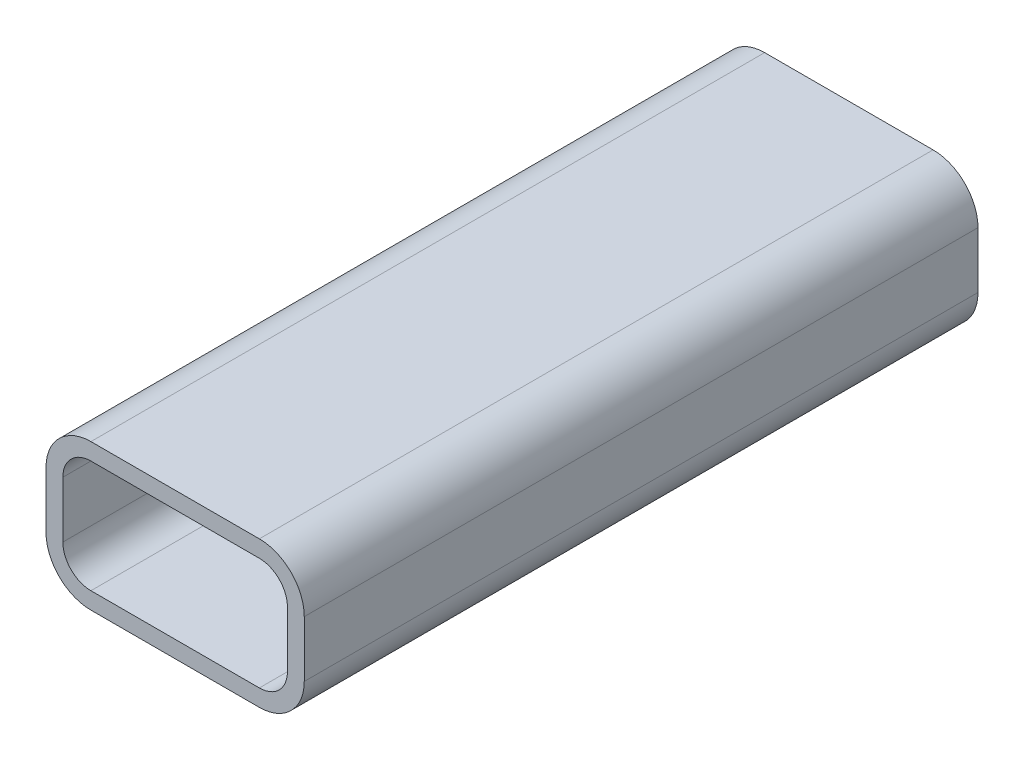
ISO-10303-21;
HEADER;
FILE_DESCRIPTION(('STEP AP214'),'2;1');
FILE_NAME('part.step','',(''),(''),'','','');
FILE_SCHEMA(('AUTOMOTIVE_DESIGN { 1 0 10303 214 1 1 1 1 }'));
ENDSEC;
DATA;
#1=APPLICATION_CONTEXT('core data for automotive mechanical design processes');
#2=APPLICATION_PROTOCOL_DEFINITION('international standard','automotive_design',2000,#1);
#3=PRODUCT_CONTEXT('',#1,'mechanical');
#4=PRODUCT('Part','Part','',(#3));
#5=PRODUCT_RELATED_PRODUCT_CATEGORY('part','',(#4));
#6=PRODUCT_DEFINITION_FORMATION('','',#4);
#7=PRODUCT_DEFINITION_CONTEXT('part definition',#1,'design');
#8=PRODUCT_DEFINITION('design','',#6,#7);
#9=PRODUCT_DEFINITION_SHAPE('','',#8);
#10=(LENGTH_UNIT() NAMED_UNIT(*) SI_UNIT(.MILLI.,.METRE.));
#11=(NAMED_UNIT(*) PLANE_ANGLE_UNIT() SI_UNIT($,.RADIAN.));
#12=(NAMED_UNIT(*) SI_UNIT($,.STERADIAN.) SOLID_ANGLE_UNIT());
#13=UNCERTAINTY_MEASURE_WITH_UNIT(LENGTH_MEASURE(1.E-05),#10,'distance_accuracy_value','');
#14=(GEOMETRIC_REPRESENTATION_CONTEXT(3) GLOBAL_UNCERTAINTY_ASSIGNED_CONTEXT((#13)) GLOBAL_UNIT_ASSIGNED_CONTEXT((#10,
#11,#12)) REPRESENTATION_CONTEXT('',''));
#15=CARTESIAN_POINT('',(0.,0.,0.));
#16=DIRECTION('',(0.,0.,1.));
#17=DIRECTION('',(1.,0.,0.));
#18=AXIS2_PLACEMENT_3D('',#15,#16,#17);
#19=CARTESIAN_POINT('',(15.,5.,60.));
#20=DIRECTION('',(0.,0.,-1.));
#21=DIRECTION('',(-1.,0.,0.));
#22=AXIS2_PLACEMENT_3D('',#19,#20,#21);
#23=PLANE('',#22);
#24=CARTESIAN_POINT('',(15.,5.,60.));
#25=DIRECTION('',(0.,0.,-1.));
#26=DIRECTION('',(-1.,0.,0.));
#27=AXIS2_PLACEMENT_3D('',#24,#25,#26);
#28=CIRCLE('',#27,8.);
#29=CARTESIAN_POINT('',(23.,4.99999999999997,60.));
#30=VERTEX_POINT('',#29);
#31=CARTESIAN_POINT('',(15.,13.,60.));
#32=VERTEX_POINT('',#31);
#33=EDGE_CURVE('E263',#30,#32,#28,.F.);
#34=ORIENTED_EDGE('',*,*,#33,.T.);
#35=DIRECTION('',(-1.,0.,0.));
#36=VECTOR('',#35,1.);
#37=CARTESIAN_POINT('',(15.,13.,60.));
#38=LINE('',#37,#36);
#39=CARTESIAN_POINT('',(-15.,13.,60.));
#40=VERTEX_POINT('',#39);
#41=EDGE_CURVE('E266',#32,#40,#38,.T.);
#42=ORIENTED_EDGE('',*,*,#41,.T.);
#43=CARTESIAN_POINT('',(-15.,5.,60.));
#44=DIRECTION('',(0.,0.,-1.));
#45=DIRECTION('',(-1.,0.,0.));
#46=AXIS2_PLACEMENT_3D('',#43,#44,#45);
#47=CIRCLE('',#46,8.);
#48=CARTESIAN_POINT('',(-23.,4.99999999999994,60.));
#49=VERTEX_POINT('',#48);
#50=EDGE_CURVE('E269',#40,#49,#47,.F.);
#51=ORIENTED_EDGE('',*,*,#50,.T.);
#52=DIRECTION('',(0.,-1.,0.));
#53=VECTOR('',#52,1.);
#54=CARTESIAN_POINT('',(-23.,4.99999999999999,60.));
#55=LINE('',#54,#53);
#56=CARTESIAN_POINT('',(-23.,-4.99999999999997,60.));
#57=VERTEX_POINT('',#56);
#58=EDGE_CURVE('E271',#49,#57,#55,.T.);
#59=ORIENTED_EDGE('',*,*,#58,.T.);
#60=CARTESIAN_POINT('',(-15.,-5.,60.));
#61=DIRECTION('',(0.,0.,-1.));
#62=DIRECTION('',(-1.,0.,0.));
#63=AXIS2_PLACEMENT_3D('',#60,#61,#62);
#64=CIRCLE('',#63,8.);
#65=CARTESIAN_POINT('',(-14.9999999999999,-13.,60.));
#66=VERTEX_POINT('',#65);
#67=EDGE_CURVE('E273',#57,#66,#64,.F.);
#68=ORIENTED_EDGE('',*,*,#67,.T.);
#69=DIRECTION('',(1.,0.,0.));
#70=VECTOR('',#69,1.);
#71=CARTESIAN_POINT('',(15.,-13.,60.));
#72=LINE('',#71,#70);
#73=CARTESIAN_POINT('',(15.,-13.,60.));
#74=VERTEX_POINT('',#73);
#75=EDGE_CURVE('E275',#66,#74,#72,.T.);
#76=ORIENTED_EDGE('',*,*,#75,.T.);
#77=CARTESIAN_POINT('',(15.,-5.,60.));
#78=DIRECTION('',(0.,0.,-1.));
#79=DIRECTION('',(-1.,0.,0.));
#80=AXIS2_PLACEMENT_3D('',#77,#78,#79);
#81=CIRCLE('',#80,8.);
#82=CARTESIAN_POINT('',(23.,-5.,60.));
#83=VERTEX_POINT('',#82);
#84=EDGE_CURVE('E277',#74,#83,#81,.F.);
#85=ORIENTED_EDGE('',*,*,#84,.T.);
#86=DIRECTION('',(0.,1.,0.));
#87=VECTOR('',#86,1.);
#88=CARTESIAN_POINT('',(23.,5.,60.));
#89=LINE('',#88,#87);
#90=EDGE_CURVE('E279',#83,#30,#89,.T.);
#91=ORIENTED_EDGE('',*,*,#90,.T.);
#92=EDGE_LOOP('',(#34,#42,#51,#59,#68,#76,#85,#91));
#93=FACE_BOUND('',#92,.T.);
#94=CARTESIAN_POINT('',(15.,5.,60.));
#95=DIRECTION('',(0.,0.,1.));
#96=DIRECTION('',(-1.,0.,0.));
#97=AXIS2_PLACEMENT_3D('',#94,#95,#96);
#98=CIRCLE('',#97,5.);
#99=CARTESIAN_POINT('',(20.,4.99999999999997,60.));
#100=VERTEX_POINT('',#99);
#101=CARTESIAN_POINT('',(15.,10.,60.));
#102=VERTEX_POINT('',#101);
#103=EDGE_CURVE('E198',#100,#102,#98,.T.);
#104=ORIENTED_EDGE('',*,*,#103,.F.);
#105=DIRECTION('',(0.,1.,0.));
#106=VECTOR('',#105,1.);
#107=CARTESIAN_POINT('',(20.,4.99999999999997,60.));
#108=LINE('',#107,#106);
#109=CARTESIAN_POINT('',(20.,-5.,60.));
#110=VERTEX_POINT('',#109);
#111=EDGE_CURVE('E231',#110,#100,#108,.T.);
#112=ORIENTED_EDGE('',*,*,#111,.F.);
#113=CARTESIAN_POINT('',(15.,-5.,60.));
#114=DIRECTION('',(0.,0.,1.));
#115=DIRECTION('',(1.,0.,0.));
#116=AXIS2_PLACEMENT_3D('',#113,#114,#115);
#117=CIRCLE('',#116,5.);
#118=CARTESIAN_POINT('',(15.,-10.,60.));
#119=VERTEX_POINT('',#118);
#120=EDGE_CURVE('E229',#119,#110,#117,.T.);
#121=ORIENTED_EDGE('',*,*,#120,.F.);
#122=DIRECTION('',(1.,0.,0.));
#123=VECTOR('',#122,1.);
#124=CARTESIAN_POINT('',(-15.,-10.,60.));
#125=LINE('',#124,#123);
#126=CARTESIAN_POINT('',(-15.,-10.,60.));
#127=VERTEX_POINT('',#126);
#128=EDGE_CURVE('E227',#127,#119,#125,.T.);
#129=ORIENTED_EDGE('',*,*,#128,.F.);
#130=CARTESIAN_POINT('',(-15.,-5.,60.));
#131=DIRECTION('',(0.,0.,1.));
#132=DIRECTION('',(1.,0.,0.));
#133=AXIS2_PLACEMENT_3D('',#130,#131,#132);
#134=CIRCLE('',#133,5.);
#135=CARTESIAN_POINT('',(-20.,-4.99999999999997,60.));
#136=VERTEX_POINT('',#135);
#137=EDGE_CURVE('E225',#136,#127,#134,.T.);
#138=ORIENTED_EDGE('',*,*,#137,.F.);
#139=DIRECTION('',(0.,-1.,0.));
#140=VECTOR('',#139,1.);
#141=CARTESIAN_POINT('',(-20.,4.99999999999996,60.));
#142=LINE('',#141,#140);
#143=CARTESIAN_POINT('',(-20.,4.99999999999996,60.));
#144=VERTEX_POINT('',#143);
#145=EDGE_CURVE('E221',#144,#136,#142,.T.);
#146=ORIENTED_EDGE('',*,*,#145,.F.);
#147=CARTESIAN_POINT('',(-15.,5.,60.));
#148=DIRECTION('',(0.,0.,1.));
#149=DIRECTION('',(1.,0.,0.));
#150=AXIS2_PLACEMENT_3D('',#147,#148,#149);
#151=CIRCLE('',#150,5.);
#152=CARTESIAN_POINT('',(-15.,10.,60.));
#153=VERTEX_POINT('',#152);
#154=EDGE_CURVE('E219',#153,#144,#151,.T.);
#155=ORIENTED_EDGE('',*,*,#154,.F.);
#156=DIRECTION('',(-1.,0.,0.));
#157=VECTOR('',#156,1.);
#158=CARTESIAN_POINT('',(-15.,10.,60.));
#159=LINE('',#158,#157);
#160=EDGE_CURVE('E206',#102,#153,#159,.T.);
#161=ORIENTED_EDGE('',*,*,#160,.F.);
#162=EDGE_LOOP('',(#104,#112,#121,#129,#138,#146,#155,#161));
#163=FACE_BOUND('',#162,.T.);
#164=ADVANCED_FACE('F85',(#93,#163),#23,.F.);
#165=CARTESIAN_POINT('',(15.,5.,-60.));
#166=DIRECTION('',(0.,0.,-1.));
#167=DIRECTION('',(-1.,0.,0.));
#168=AXIS2_PLACEMENT_3D('',#165,#166,#167);
#169=PLANE('',#168);
#170=CARTESIAN_POINT('',(15.,5.,-60.));
#171=DIRECTION('',(0.,0.,-1.));
#172=DIRECTION('',(-1.,0.,0.));
#173=AXIS2_PLACEMENT_3D('',#170,#171,#172);
#174=CIRCLE('',#173,8.);
#175=CARTESIAN_POINT('',(23.,4.99999999999997,-60.));
#176=VERTEX_POINT('',#175);
#177=CARTESIAN_POINT('',(15.,13.,-60.));
#178=VERTEX_POINT('',#177);
#179=EDGE_CURVE('E214',#176,#178,#174,.F.);
#180=ORIENTED_EDGE('',*,*,#179,.F.);
#181=DIRECTION('',(0.,1.,0.));
#182=VECTOR('',#181,1.);
#183=CARTESIAN_POINT('',(23.,5.,-60.));
#184=LINE('',#183,#182);
#185=CARTESIAN_POINT('',(23.,-5.,-60.));
#186=VERTEX_POINT('',#185);
#187=EDGE_CURVE('E267',#186,#176,#184,.T.);
#188=ORIENTED_EDGE('',*,*,#187,.F.);
#189=CARTESIAN_POINT('',(15.,-5.,-60.));
#190=DIRECTION('',(0.,0.,-1.));
#191=DIRECTION('',(-1.,0.,0.));
#192=AXIS2_PLACEMENT_3D('',#189,#190,#191);
#193=CIRCLE('',#192,8.);
#194=CARTESIAN_POINT('',(15.,-13.,-60.));
#195=VERTEX_POINT('',#194);
#196=EDGE_CURVE('E294',#195,#186,#193,.F.);
#197=ORIENTED_EDGE('',*,*,#196,.F.);
#198=DIRECTION('',(1.,0.,0.));
#199=VECTOR('',#198,1.);
#200=CARTESIAN_POINT('',(15.,-13.,-60.));
#201=LINE('',#200,#199);
#202=CARTESIAN_POINT('',(-14.9999999999999,-13.,-60.));
#203=VERTEX_POINT('',#202);
#204=EDGE_CURVE('E292',#203,#195,#201,.T.);
#205=ORIENTED_EDGE('',*,*,#204,.F.);
#206=CARTESIAN_POINT('',(-15.,-5.,-60.));
#207=DIRECTION('',(0.,0.,-1.));
#208=DIRECTION('',(-1.,0.,0.));
#209=AXIS2_PLACEMENT_3D('',#206,#207,#208);
#210=CIRCLE('',#209,8.);
#211=CARTESIAN_POINT('',(-23.,-4.99999999999997,-60.));
#212=VERTEX_POINT('',#211);
#213=EDGE_CURVE('E290',#212,#203,#210,.F.);
#214=ORIENTED_EDGE('',*,*,#213,.F.);
#215=DIRECTION('',(0.,-1.,0.));
#216=VECTOR('',#215,1.);
#217=CARTESIAN_POINT('',(-23.,4.99999999999999,-60.));
#218=LINE('',#217,#216);
#219=CARTESIAN_POINT('',(-23.,4.99999999999994,-60.));
#220=VERTEX_POINT('',#219);
#221=EDGE_CURVE('E288',#220,#212,#218,.T.);
#222=ORIENTED_EDGE('',*,*,#221,.F.);
#223=CARTESIAN_POINT('',(-15.,5.,-60.));
#224=DIRECTION('',(0.,0.,-1.));
#225=DIRECTION('',(-1.,0.,0.));
#226=AXIS2_PLACEMENT_3D('',#223,#224,#225);
#227=CIRCLE('',#226,8.);
#228=CARTESIAN_POINT('',(-15.,13.,-60.));
#229=VERTEX_POINT('',#228);
#230=EDGE_CURVE('E286',#229,#220,#227,.F.);
#231=ORIENTED_EDGE('',*,*,#230,.F.);
#232=DIRECTION('',(-1.,0.,0.));
#233=VECTOR('',#232,1.);
#234=CARTESIAN_POINT('',(15.,13.,-60.));
#235=LINE('',#234,#233);
#236=EDGE_CURVE('E284',#178,#229,#235,.T.);
#237=ORIENTED_EDGE('',*,*,#236,.F.);
#238=EDGE_LOOP('',(#180,#188,#197,#205,#214,#222,#231,#237));
#239=FACE_BOUND('',#238,.T.);
#240=DIRECTION('',(0.,1.,0.));
#241=VECTOR('',#240,1.);
#242=CARTESIAN_POINT('',(20.,4.99999999999997,-60.));
#243=LINE('',#242,#241);
#244=CARTESIAN_POINT('',(20.,-5.,-60.));
#245=VERTEX_POINT('',#244);
#246=CARTESIAN_POINT('',(20.,4.99999999999997,-60.));
#247=VERTEX_POINT('',#246);
#248=EDGE_CURVE('E207',#245,#247,#243,.T.);
#249=ORIENTED_EDGE('',*,*,#248,.T.);
#250=CARTESIAN_POINT('',(15.,5.,-60.));
#251=DIRECTION('',(0.,0.,1.));
#252=DIRECTION('',(-1.,0.,0.));
#253=AXIS2_PLACEMENT_3D('',#250,#251,#252);
#254=CIRCLE('',#253,5.);
#255=CARTESIAN_POINT('',(15.,10.,-60.));
#256=VERTEX_POINT('',#255);
#257=EDGE_CURVE('E108',#247,#256,#254,.T.);
#258=ORIENTED_EDGE('',*,*,#257,.T.);
#259=DIRECTION('',(-1.,0.,0.));
#260=VECTOR('',#259,1.);
#261=CARTESIAN_POINT('',(-15.,10.,-60.));
#262=LINE('',#261,#260);
#263=CARTESIAN_POINT('',(-15.,10.,-60.));
#264=VERTEX_POINT('',#263);
#265=EDGE_CURVE('E213',#256,#264,#262,.T.);
#266=ORIENTED_EDGE('',*,*,#265,.T.);
#267=CARTESIAN_POINT('',(-15.,5.,-60.));
#268=DIRECTION('',(0.,0.,1.));
#269=DIRECTION('',(1.,0.,0.));
#270=AXIS2_PLACEMENT_3D('',#267,#268,#269);
#271=CIRCLE('',#270,5.);
#272=CARTESIAN_POINT('',(-20.,4.99999999999996,-60.));
#273=VERTEX_POINT('',#272);
#274=EDGE_CURVE('E235',#264,#273,#271,.T.);
#275=ORIENTED_EDGE('',*,*,#274,.T.);
#276=DIRECTION('',(0.,-1.,0.));
#277=VECTOR('',#276,1.);
#278=CARTESIAN_POINT('',(-20.,4.99999999999996,-60.));
#279=LINE('',#278,#277);
#280=CARTESIAN_POINT('',(-20.,-4.99999999999997,-60.));
#281=VERTEX_POINT('',#280);
#282=EDGE_CURVE('E238',#273,#281,#279,.T.);
#283=ORIENTED_EDGE('',*,*,#282,.T.);
#284=CARTESIAN_POINT('',(-15.,-5.,-60.));
#285=DIRECTION('',(0.,0.,1.));
#286=DIRECTION('',(1.,0.,0.));
#287=AXIS2_PLACEMENT_3D('',#284,#285,#286);
#288=CIRCLE('',#287,5.);
#289=CARTESIAN_POINT('',(-15.,-10.,-60.));
#290=VERTEX_POINT('',#289);
#291=EDGE_CURVE('E241',#281,#290,#288,.T.);
#292=ORIENTED_EDGE('',*,*,#291,.T.);
#293=DIRECTION('',(1.,0.,0.));
#294=VECTOR('',#293,1.);
#295=CARTESIAN_POINT('',(-15.,-10.,-60.));
#296=LINE('',#295,#294);
#297=CARTESIAN_POINT('',(15.,-10.,-60.));
#298=VERTEX_POINT('',#297);
#299=EDGE_CURVE('E244',#290,#298,#296,.T.);
#300=ORIENTED_EDGE('',*,*,#299,.T.);
#301=CARTESIAN_POINT('',(15.,-5.,-60.));
#302=DIRECTION('',(0.,0.,1.));
#303=DIRECTION('',(1.,0.,0.));
#304=AXIS2_PLACEMENT_3D('',#301,#302,#303);
#305=CIRCLE('',#304,5.);
#306=EDGE_CURVE('E247',#298,#245,#305,.T.);
#307=ORIENTED_EDGE('',*,*,#306,.T.);
#308=EDGE_LOOP('',(#249,#258,#266,#275,#283,#292,#300,#307));
#309=FACE_BOUND('',#308,.T.);
#310=ADVANCED_FACE('F324',(#239,#309),#169,.T.);
#311=CARTESIAN_POINT('',(15.,5.,60.));
#312=DIRECTION('',(0.,0.,-1.));
#313=DIRECTION('',(-1.,0.,0.));
#314=AXIS2_PLACEMENT_3D('',#311,#312,#313);
#315=CYLINDRICAL_SURFACE('',#314,8.);
#316=ORIENTED_EDGE('',*,*,#179,.T.);
#317=DIRECTION('',(0.,0.,-1.));
#318=VECTOR('',#317,1.);
#319=CARTESIAN_POINT('',(15.,13.,60.));
#320=LINE('',#319,#318);
#321=EDGE_CURVE('E12',#32,#178,#320,.T.);
#322=ORIENTED_EDGE('',*,*,#321,.F.);
#323=ORIENTED_EDGE('',*,*,#33,.F.);
#324=DIRECTION('',(0.,0.,-1.));
#325=VECTOR('',#324,1.);
#326=CARTESIAN_POINT('',(23.,4.99999999999997,60.));
#327=LINE('',#326,#325);
#328=EDGE_CURVE('E281',#30,#176,#327,.T.);
#329=ORIENTED_EDGE('',*,*,#328,.T.);
#330=EDGE_LOOP('',(#316,#322,#323,#329));
#331=FACE_BOUND('',#330,.T.);
#332=ADVANCED_FACE('F87',(#331),#315,.T.);
#333=CARTESIAN_POINT('',(15.,13.,60.));
#334=DIRECTION('',(0.,-1.,0.));
#335=DIRECTION('',(0.,0.,-1.));
#336=AXIS2_PLACEMENT_3D('',#333,#334,#335);
#337=PLANE('',#336);
#338=ORIENTED_EDGE('',*,*,#236,.T.);
#339=DIRECTION('',(0.,0.,-1.));
#340=VECTOR('',#339,1.);
#341=CARTESIAN_POINT('',(-15.,13.,60.));
#342=LINE('',#341,#340);
#343=EDGE_CURVE('E93',#40,#229,#342,.T.);
#344=ORIENTED_EDGE('',*,*,#343,.F.);
#345=ORIENTED_EDGE('',*,*,#41,.F.);
#346=ORIENTED_EDGE('',*,*,#321,.T.);
#347=EDGE_LOOP('',(#338,#344,#345,#346));
#348=FACE_BOUND('',#347,.T.);
#349=ADVANCED_FACE('F341',(#348),#337,.F.);
#350=CARTESIAN_POINT('',(-15.,5.,60.));
#351=DIRECTION('',(0.,0.,-1.));
#352=DIRECTION('',(-1.,0.,0.));
#353=AXIS2_PLACEMENT_3D('',#350,#351,#352);
#354=CYLINDRICAL_SURFACE('',#353,8.);
#355=ORIENTED_EDGE('',*,*,#230,.T.);
#356=DIRECTION('',(0.,0.,-1.));
#357=VECTOR('',#356,1.);
#358=CARTESIAN_POINT('',(-23.,4.99999999999994,60.));
#359=LINE('',#358,#357);
#360=EDGE_CURVE('E311',#49,#220,#359,.T.);
#361=ORIENTED_EDGE('',*,*,#360,.F.);
#362=ORIENTED_EDGE('',*,*,#50,.F.);
#363=ORIENTED_EDGE('',*,*,#343,.T.);
#364=EDGE_LOOP('',(#355,#361,#362,#363));
#365=FACE_BOUND('',#364,.T.);
#366=ADVANCED_FACE('F318',(#365),#354,.T.);
#367=CARTESIAN_POINT('',(-23.,4.99999999999999,60.));
#368=DIRECTION('',(1.,0.,0.));
#369=DIRECTION('',(0.,1.,0.));
#370=AXIS2_PLACEMENT_3D('',#367,#368,#369);
#371=PLANE('',#370);
#372=ORIENTED_EDGE('',*,*,#221,.T.);
#373=DIRECTION('',(0.,0.,-1.));
#374=VECTOR('',#373,1.);
#375=CARTESIAN_POINT('',(-23.,-4.99999999999997,60.));
#376=LINE('',#375,#374);
#377=EDGE_CURVE('E308',#57,#212,#376,.T.);
#378=ORIENTED_EDGE('',*,*,#377,.F.);
#379=ORIENTED_EDGE('',*,*,#58,.F.);
#380=ORIENTED_EDGE('',*,*,#360,.T.);
#381=EDGE_LOOP('',(#372,#378,#379,#380));
#382=FACE_BOUND('',#381,.T.);
#383=ADVANCED_FACE('F330',(#382),#371,.F.);
#384=CARTESIAN_POINT('',(-15.,-5.,60.));
#385=DIRECTION('',(0.,0.,-1.));
#386=DIRECTION('',(-1.,0.,0.));
#387=AXIS2_PLACEMENT_3D('',#384,#385,#386);
#388=CYLINDRICAL_SURFACE('',#387,8.);
#389=ORIENTED_EDGE('',*,*,#213,.T.);
#390=DIRECTION('',(0.,0.,-1.));
#391=VECTOR('',#390,1.);
#392=CARTESIAN_POINT('',(-14.9999999999999,-13.,60.));
#393=LINE('',#392,#391);
#394=EDGE_CURVE('E305',#66,#203,#393,.T.);
#395=ORIENTED_EDGE('',*,*,#394,.F.);
#396=ORIENTED_EDGE('',*,*,#67,.F.);
#397=ORIENTED_EDGE('',*,*,#377,.T.);
#398=EDGE_LOOP('',(#389,#395,#396,#397));
#399=FACE_BOUND('',#398,.T.);
#400=ADVANCED_FACE('F334',(#399),#388,.T.);
#401=CARTESIAN_POINT('',(15.,-13.,60.));
#402=DIRECTION('',(0.,1.,0.));
#403=DIRECTION('',(0.,0.,1.));
#404=AXIS2_PLACEMENT_3D('',#401,#402,#403);
#405=PLANE('',#404);
#406=ORIENTED_EDGE('',*,*,#204,.T.);
#407=DIRECTION('',(0.,0.,-1.));
#408=VECTOR('',#407,1.);
#409=CARTESIAN_POINT('',(15.,-13.,60.));
#410=LINE('',#409,#408);
#411=EDGE_CURVE('E302',#74,#195,#410,.T.);
#412=ORIENTED_EDGE('',*,*,#411,.F.);
#413=ORIENTED_EDGE('',*,*,#75,.F.);
#414=ORIENTED_EDGE('',*,*,#394,.T.);
#415=EDGE_LOOP('',(#406,#412,#413,#414));
#416=FACE_BOUND('',#415,.T.);
#417=ADVANCED_FACE('F354',(#416),#405,.F.);
#418=CARTESIAN_POINT('',(15.,-5.,60.));
#419=DIRECTION('',(0.,0.,-1.));
#420=DIRECTION('',(-1.,0.,0.));
#421=AXIS2_PLACEMENT_3D('',#418,#419,#420);
#422=CYLINDRICAL_SURFACE('',#421,8.);
#423=ORIENTED_EDGE('',*,*,#196,.T.);
#424=DIRECTION('',(0.,0.,-1.));
#425=VECTOR('',#424,1.);
#426=CARTESIAN_POINT('',(23.,-5.,60.));
#427=LINE('',#426,#425);
#428=EDGE_CURVE('E299',#83,#186,#427,.T.);
#429=ORIENTED_EDGE('',*,*,#428,.F.);
#430=ORIENTED_EDGE('',*,*,#84,.F.);
#431=ORIENTED_EDGE('',*,*,#411,.T.);
#432=EDGE_LOOP('',(#423,#429,#430,#431));
#433=FACE_BOUND('',#432,.T.);
#434=ADVANCED_FACE('F352',(#433),#422,.T.);
#435=CARTESIAN_POINT('',(23.,5.,60.));
#436=DIRECTION('',(-1.,0.,0.));
#437=DIRECTION('',(0.,-1.,0.));
#438=AXIS2_PLACEMENT_3D('',#435,#436,#437);
#439=PLANE('',#438);
#440=ORIENTED_EDGE('',*,*,#187,.T.);
#441=ORIENTED_EDGE('',*,*,#328,.F.);
#442=ORIENTED_EDGE('',*,*,#90,.F.);
#443=ORIENTED_EDGE('',*,*,#428,.T.);
#444=EDGE_LOOP('',(#440,#441,#442,#443));
#445=FACE_BOUND('',#444,.T.);
#446=ADVANCED_FACE('F347',(#445),#439,.F.);
#447=CARTESIAN_POINT('',(15.,5.,60.));
#448=DIRECTION('',(0.,0.,-1.));
#449=DIRECTION('',(-1.,0.,0.));
#450=AXIS2_PLACEMENT_3D('',#447,#448,#449);
#451=CYLINDRICAL_SURFACE('',#450,5.);
#452=ORIENTED_EDGE('',*,*,#257,.F.);
#453=DIRECTION('',(0.,0.,-1.));
#454=VECTOR('',#453,1.);
#455=CARTESIAN_POINT('',(20.,4.99999999999997,60.));
#456=LINE('',#455,#454);
#457=EDGE_CURVE('E202',#100,#247,#456,.T.);
#458=ORIENTED_EDGE('',*,*,#457,.F.);
#459=ORIENTED_EDGE('',*,*,#103,.T.);
#460=DIRECTION('',(0.,0.,-1.));
#461=VECTOR('',#460,1.);
#462=CARTESIAN_POINT('',(15.,10.,60.));
#463=LINE('',#462,#461);
#464=EDGE_CURVE('E201',#102,#256,#463,.T.);
#465=ORIENTED_EDGE('',*,*,#464,.T.);
#466=EDGE_LOOP('',(#452,#458,#459,#465));
#467=FACE_BOUND('',#466,.T.);
#468=ADVANCED_FACE('F200',(#467),#451,.F.);
#469=CARTESIAN_POINT('',(-15.,10.,60.));
#470=DIRECTION('',(0.,-1.,0.));
#471=DIRECTION('',(0.,0.,-1.));
#472=AXIS2_PLACEMENT_3D('',#469,#470,#471);
#473=PLANE('',#472);
#474=ORIENTED_EDGE('',*,*,#265,.F.);
#475=ORIENTED_EDGE('',*,*,#464,.F.);
#476=ORIENTED_EDGE('',*,*,#160,.T.);
#477=DIRECTION('',(0.,0.,-1.));
#478=VECTOR('',#477,1.);
#479=CARTESIAN_POINT('',(-15.,10.,60.));
#480=LINE('',#479,#478);
#481=EDGE_CURVE('E215',#153,#264,#480,.T.);
#482=ORIENTED_EDGE('',*,*,#481,.T.);
#483=EDGE_LOOP('',(#474,#475,#476,#482));
#484=FACE_BOUND('',#483,.T.);
#485=ADVANCED_FACE('F210',(#484),#473,.T.);
#486=CARTESIAN_POINT('',(-15.,5.,60.));
#487=DIRECTION('',(0.,0.,-1.));
#488=DIRECTION('',(-1.,0.,0.));
#489=AXIS2_PLACEMENT_3D('',#486,#487,#488);
#490=CYLINDRICAL_SURFACE('',#489,5.);
#491=ORIENTED_EDGE('',*,*,#274,.F.);
#492=ORIENTED_EDGE('',*,*,#481,.F.);
#493=ORIENTED_EDGE('',*,*,#154,.T.);
#494=DIRECTION('',(0.,0.,-1.));
#495=VECTOR('',#494,1.);
#496=CARTESIAN_POINT('',(-20.,4.99999999999996,60.));
#497=LINE('',#496,#495);
#498=EDGE_CURVE('E260',#144,#273,#497,.T.);
#499=ORIENTED_EDGE('',*,*,#498,.T.);
#500=EDGE_LOOP('',(#491,#492,#493,#499));
#501=FACE_BOUND('',#500,.T.);
#502=ADVANCED_FACE('F379',(#501),#490,.F.);
#503=CARTESIAN_POINT('',(-20.,4.99999999999996,60.));
#504=DIRECTION('',(1.,0.,0.));
#505=DIRECTION('',(0.,1.,0.));
#506=AXIS2_PLACEMENT_3D('',#503,#504,#505);
#507=PLANE('',#506);
#508=ORIENTED_EDGE('',*,*,#282,.F.);
#509=ORIENTED_EDGE('',*,*,#498,.F.);
#510=ORIENTED_EDGE('',*,*,#145,.T.);
#511=DIRECTION('',(0.,0.,-1.));
#512=VECTOR('',#511,1.);
#513=CARTESIAN_POINT('',(-20.,-4.99999999999997,60.));
#514=LINE('',#513,#512);
#515=EDGE_CURVE('E258',#136,#281,#514,.T.);
#516=ORIENTED_EDGE('',*,*,#515,.T.);
#517=EDGE_LOOP('',(#508,#509,#510,#516));
#518=FACE_BOUND('',#517,.T.);
#519=ADVANCED_FACE('F383',(#518),#507,.T.);
#520=CARTESIAN_POINT('',(-15.,-5.,60.));
#521=DIRECTION('',(0.,0.,-1.));
#522=DIRECTION('',(-1.,0.,0.));
#523=AXIS2_PLACEMENT_3D('',#520,#521,#522);
#524=CYLINDRICAL_SURFACE('',#523,5.);
#525=ORIENTED_EDGE('',*,*,#291,.F.);
#526=ORIENTED_EDGE('',*,*,#515,.F.);
#527=ORIENTED_EDGE('',*,*,#137,.T.);
#528=DIRECTION('',(0.,0.,-1.));
#529=VECTOR('',#528,1.);
#530=CARTESIAN_POINT('',(-15.,-10.,60.));
#531=LINE('',#530,#529);
#532=EDGE_CURVE('E256',#127,#290,#531,.T.);
#533=ORIENTED_EDGE('',*,*,#532,.T.);
#534=EDGE_LOOP('',(#525,#526,#527,#533));
#535=FACE_BOUND('',#534,.T.);
#536=ADVANCED_FACE('F389',(#535),#524,.F.);
#537=CARTESIAN_POINT('',(-15.,-10.,60.));
#538=DIRECTION('',(0.,1.,0.));
#539=DIRECTION('',(0.,0.,1.));
#540=AXIS2_PLACEMENT_3D('',#537,#538,#539);
#541=PLANE('',#540);
#542=ORIENTED_EDGE('',*,*,#299,.F.);
#543=ORIENTED_EDGE('',*,*,#532,.F.);
#544=ORIENTED_EDGE('',*,*,#128,.T.);
#545=DIRECTION('',(0.,0.,-1.));
#546=VECTOR('',#545,1.);
#547=CARTESIAN_POINT('',(15.,-10.,60.));
#548=LINE('',#547,#546);
#549=EDGE_CURVE('E254',#119,#298,#548,.T.);
#550=ORIENTED_EDGE('',*,*,#549,.T.);
#551=EDGE_LOOP('',(#542,#543,#544,#550));
#552=FACE_BOUND('',#551,.T.);
#553=ADVANCED_FACE('F393',(#552),#541,.T.);
#554=CARTESIAN_POINT('',(15.,-5.,60.));
#555=DIRECTION('',(0.,0.,-1.));
#556=DIRECTION('',(-1.,0.,0.));
#557=AXIS2_PLACEMENT_3D('',#554,#555,#556);
#558=CYLINDRICAL_SURFACE('',#557,5.);
#559=ORIENTED_EDGE('',*,*,#306,.F.);
#560=ORIENTED_EDGE('',*,*,#549,.F.);
#561=ORIENTED_EDGE('',*,*,#120,.T.);
#562=DIRECTION('',(0.,0.,-1.));
#563=VECTOR('',#562,1.);
#564=CARTESIAN_POINT('',(20.,-5.,60.));
#565=LINE('',#564,#563);
#566=EDGE_CURVE('E100',#110,#245,#565,.T.);
#567=ORIENTED_EDGE('',*,*,#566,.T.);
#568=EDGE_LOOP('',(#559,#560,#561,#567));
#569=FACE_BOUND('',#568,.T.);
#570=ADVANCED_FACE('F397',(#569),#558,.F.);
#571=CARTESIAN_POINT('',(20.,4.99999999999997,60.));
#572=DIRECTION('',(-1.,0.,0.));
#573=DIRECTION('',(0.,-1.,0.));
#574=AXIS2_PLACEMENT_3D('',#571,#572,#573);
#575=PLANE('',#574);
#576=ORIENTED_EDGE('',*,*,#248,.F.);
#577=ORIENTED_EDGE('',*,*,#566,.F.);
#578=ORIENTED_EDGE('',*,*,#111,.T.);
#579=ORIENTED_EDGE('',*,*,#457,.T.);
#580=EDGE_LOOP('',(#576,#577,#578,#579));
#581=FACE_BOUND('',#580,.T.);
#582=ADVANCED_FACE('F401',(#581),#575,.T.);
#583=CLOSED_SHELL('',(#164,#310,#332,#349,#366,#383,#400,#417,#434,#446,#468,#485,#502,#519,
#536,#553,#570,#582));
#584=MANIFOLD_SOLID_BREP('B2',#583);
#585=ADVANCED_BREP_SHAPE_REPRESENTATION('',(#18,#584),#14);
#586=SHAPE_DEFINITION_REPRESENTATION(#9,#585);
ENDSEC;
END-ISO-10303-21;
